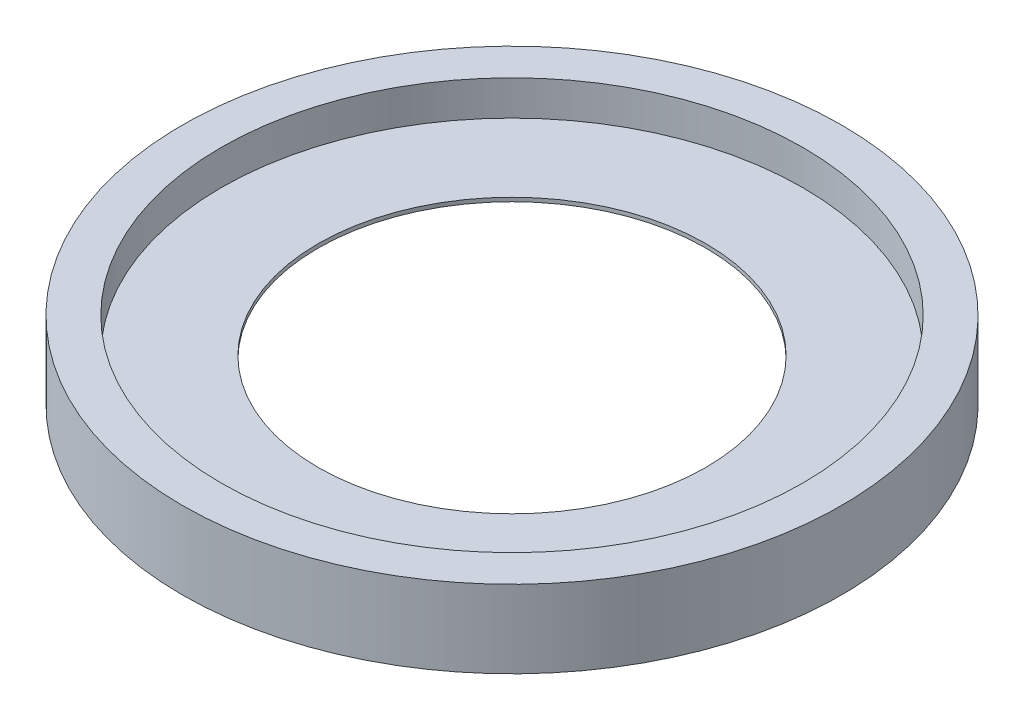
ISO-10303-21;
HEADER;
FILE_DESCRIPTION(('STEP AP214'),'2;1');
FILE_NAME('part.step','',(''),(''),'','','');
FILE_SCHEMA(('AUTOMOTIVE_DESIGN { 1 0 10303 214 1 1 1 1 }'));
ENDSEC;
DATA;
#1=APPLICATION_CONTEXT('core data for automotive mechanical design processes');
#2=APPLICATION_PROTOCOL_DEFINITION('international standard','automotive_design',2000,#1);
#3=PRODUCT_CONTEXT('',#1,'mechanical');
#4=PRODUCT('Part','Part','',(#3));
#5=PRODUCT_RELATED_PRODUCT_CATEGORY('part','',(#4));
#6=PRODUCT_DEFINITION_FORMATION('','',#4);
#7=PRODUCT_DEFINITION_CONTEXT('part definition',#1,'design');
#8=PRODUCT_DEFINITION('design','',#6,#7);
#9=PRODUCT_DEFINITION_SHAPE('','',#8);
#10=(LENGTH_UNIT() NAMED_UNIT(*) SI_UNIT(.MILLI.,.METRE.));
#11=(NAMED_UNIT(*) PLANE_ANGLE_UNIT() SI_UNIT($,.RADIAN.));
#12=(NAMED_UNIT(*) SI_UNIT($,.STERADIAN.) SOLID_ANGLE_UNIT());
#13=UNCERTAINTY_MEASURE_WITH_UNIT(LENGTH_MEASURE(1.E-05),#10,'distance_accuracy_value','');
#14=(GEOMETRIC_REPRESENTATION_CONTEXT(3) GLOBAL_UNCERTAINTY_ASSIGNED_CONTEXT((#13)) GLOBAL_UNIT_ASSIGNED_CONTEXT((#10,
#11,#12)) REPRESENTATION_CONTEXT('',''));
#15=CARTESIAN_POINT('',(0.,0.,0.));
#16=DIRECTION('',(0.,0.,1.));
#17=DIRECTION('',(1.,0.,0.));
#18=AXIS2_PLACEMENT_3D('',#15,#16,#17);
#19=CARTESIAN_POINT('',(0.,2.,0.));
#20=DIRECTION('',(0.,-1.,0.));
#21=DIRECTION('',(0.,0.,-1.));
#22=AXIS2_PLACEMENT_3D('',#19,#20,#21);
#23=CYLINDRICAL_SURFACE('',#22,7.5);
#24=CARTESIAN_POINT('',(0.,0.,0.));
#25=DIRECTION('',(0.,1.,0.));
#26=DIRECTION('',(0.,0.,1.));
#27=AXIS2_PLACEMENT_3D('',#24,#25,#26);
#28=CIRCLE('',#27,7.5);
#29=CARTESIAN_POINT('',(0.,0.,7.5));
#30=VERTEX_POINT('',#29);
#31=EDGE_CURVE('E62',#30,#30,#28,.T.);
#32=ORIENTED_EDGE('',*,*,#31,.F.);
#33=EDGE_LOOP('',(#32));
#34=FACE_BOUND('',#33,.T.);
#35=CARTESIAN_POINT('',(0.,1.,0.));
#36=DIRECTION('',(0.,1.,0.));
#37=DIRECTION('',(0.,0.,1.));
#38=AXIS2_PLACEMENT_3D('',#35,#36,#37);
#39=CIRCLE('',#38,7.5);
#40=CARTESIAN_POINT('',(0.,1.,7.5));
#41=VERTEX_POINT('',#40);
#42=EDGE_CURVE('E66',#41,#41,#39,.T.);
#43=ORIENTED_EDGE('',*,*,#42,.T.);
#44=EDGE_LOOP('',(#43));
#45=FACE_BOUND('',#44,.T.);
#46=ADVANCED_FACE('F41',(#34,#45),#23,.F.);
#47=CARTESIAN_POINT('',(0.,2.,0.));
#48=DIRECTION('',(0.,1.,0.));
#49=DIRECTION('',(0.,0.,1.));
#50=AXIS2_PLACEMENT_3D('',#47,#48,#49);
#51=PLANE('',#50);
#52=CARTESIAN_POINT('',(0.,2.,0.));
#53=DIRECTION('',(0.,1.,0.));
#54=DIRECTION('',(0.,0.,1.));
#55=AXIS2_PLACEMENT_3D('',#52,#53,#54);
#56=CIRCLE('',#55,8.5);
#57=CARTESIAN_POINT('',(0.,2.,8.5));
#58=VERTEX_POINT('',#57);
#59=EDGE_CURVE('E49',#58,#58,#56,.T.);
#60=ORIENTED_EDGE('',*,*,#59,.T.);
#61=EDGE_LOOP('',(#60));
#62=FACE_BOUND('',#61,.T.);
#63=CARTESIAN_POINT('',(0.,2.,0.));
#64=DIRECTION('',(0.,1.,0.));
#65=DIRECTION('',(0.,0.,1.));
#66=AXIS2_PLACEMENT_3D('',#63,#64,#65);
#67=CIRCLE('',#66,7.5);
#68=CARTESIAN_POINT('',(0.,2.,7.5));
#69=VERTEX_POINT('',#68);
#70=EDGE_CURVE('E60',#69,#69,#67,.T.);
#71=ORIENTED_EDGE('',*,*,#70,.F.);
#72=EDGE_LOOP('',(#71));
#73=FACE_BOUND('',#72,.T.);
#74=ADVANCED_FACE('F100',(#62,#73),#51,.T.);
#75=CARTESIAN_POINT('',(0.,0.,0.));
#76=DIRECTION('',(0.,1.,0.));
#77=DIRECTION('',(0.,0.,1.));
#78=AXIS2_PLACEMENT_3D('',#75,#76,#77);
#79=PLANE('',#78);
#80=CARTESIAN_POINT('',(0.,0.,0.));
#81=DIRECTION('',(0.,1.,0.));
#82=DIRECTION('',(0.,0.,1.));
#83=AXIS2_PLACEMENT_3D('',#80,#81,#82);
#84=CIRCLE('',#83,8.5);
#85=CARTESIAN_POINT('',(0.,0.,8.5));
#86=VERTEX_POINT('',#85);
#87=EDGE_CURVE('E54',#86,#86,#84,.T.);
#88=ORIENTED_EDGE('',*,*,#87,.F.);
#89=EDGE_LOOP('',(#88));
#90=FACE_BOUND('',#89,.T.);
#91=ORIENTED_EDGE('',*,*,#31,.T.);
#92=EDGE_LOOP('',(#91));
#93=FACE_BOUND('',#92,.T.);
#94=ADVANCED_FACE('F105',(#90,#93),#79,.F.);
#95=CARTESIAN_POINT('',(0.,2.,0.));
#96=DIRECTION('',(0.,-1.,0.));
#97=DIRECTION('',(0.,0.,-1.));
#98=AXIS2_PLACEMENT_3D('',#95,#96,#97);
#99=CYLINDRICAL_SURFACE('',#98,8.5);
#100=ORIENTED_EDGE('',*,*,#59,.F.);
#101=EDGE_LOOP('',(#100));
#102=FACE_BOUND('',#101,.T.);
#103=ORIENTED_EDGE('',*,*,#87,.T.);
#104=EDGE_LOOP('',(#103));
#105=FACE_BOUND('',#104,.T.);
#106=ADVANCED_FACE('F43',(#102,#105),#99,.T.);
#107=CARTESIAN_POINT('',(0.,1.1,0.));
#108=DIRECTION('',(0.,1.,0.));
#109=DIRECTION('',(0.,0.,1.));
#110=AXIS2_PLACEMENT_3D('',#107,#108,#109);
#111=CIRCLE('',#110,7.5);
#112=CARTESIAN_POINT('',(0.,1.1,7.5));
#113=VERTEX_POINT('',#112);
#114=EDGE_CURVE('E10',#113,#113,#111,.T.);
#115=ORIENTED_EDGE('',*,*,#114,.F.);
#116=EDGE_LOOP('',(#115));
#117=FACE_BOUND('',#116,.T.);
#118=ORIENTED_EDGE('',*,*,#70,.T.);
#119=EDGE_LOOP('',(#118));
#120=FACE_BOUND('',#119,.T.);
#121=ADVANCED_FACE('F88',(#117,#120),#23,.F.);
#122=CARTESIAN_POINT('',(0.,1.1,0.));
#123=DIRECTION('',(0.,1.,0.));
#124=DIRECTION('',(0.,0.,1.));
#125=AXIS2_PLACEMENT_3D('',#122,#123,#124);
#126=PLANE('',#125);
#127=ORIENTED_EDGE('',*,*,#114,.T.);
#128=EDGE_LOOP('',(#127));
#129=FACE_BOUND('',#128,.T.);
#130=CARTESIAN_POINT('',(0.,1.1,0.));
#131=DIRECTION('',(0.,1.,0.));
#132=DIRECTION('',(0.,0.,1.));
#133=AXIS2_PLACEMENT_3D('',#130,#131,#132);
#134=CIRCLE('',#133,5.);
#135=CARTESIAN_POINT('',(0.,1.1,5.));
#136=VERTEX_POINT('',#135);
#137=EDGE_CURVE('E73',#136,#136,#134,.T.);
#138=ORIENTED_EDGE('',*,*,#137,.F.);
#139=EDGE_LOOP('',(#138));
#140=FACE_BOUND('',#139,.T.);
#141=ADVANCED_FACE('F85',(#129,#140),#126,.T.);
#142=CARTESIAN_POINT('',(0.,1.,0.));
#143=DIRECTION('',(0.,1.,0.));
#144=DIRECTION('',(0.,0.,1.));
#145=AXIS2_PLACEMENT_3D('',#142,#143,#144);
#146=PLANE('',#145);
#147=ORIENTED_EDGE('',*,*,#42,.F.);
#148=EDGE_LOOP('',(#147));
#149=FACE_BOUND('',#148,.T.);
#150=CARTESIAN_POINT('',(0.,1.,0.));
#151=DIRECTION('',(0.,1.,0.));
#152=DIRECTION('',(0.,0.,1.));
#153=AXIS2_PLACEMENT_3D('',#150,#151,#152);
#154=CIRCLE('',#153,5.);
#155=CARTESIAN_POINT('',(0.,1.,5.));
#156=VERTEX_POINT('',#155);
#157=EDGE_CURVE('E74',#156,#156,#154,.T.);
#158=ORIENTED_EDGE('',*,*,#157,.T.);
#159=EDGE_LOOP('',(#158));
#160=FACE_BOUND('',#159,.T.);
#161=ADVANCED_FACE('F87',(#149,#160),#146,.F.);
#162=CARTESIAN_POINT('',(0.,1.1,0.));
#163=DIRECTION('',(0.,-1.,0.));
#164=DIRECTION('',(0.,0.,-1.));
#165=AXIS2_PLACEMENT_3D('',#162,#163,#164);
#166=CYLINDRICAL_SURFACE('',#165,5.);
#167=ORIENTED_EDGE('',*,*,#137,.T.);
#168=EDGE_LOOP('',(#167));
#169=FACE_BOUND('',#168,.T.);
#170=ORIENTED_EDGE('',*,*,#157,.F.);
#171=EDGE_LOOP('',(#170));
#172=FACE_BOUND('',#171,.T.);
#173=ADVANCED_FACE('F82',(#169,#172),#166,.F.);
#174=CLOSED_SHELL('',(#46,#74,#94,#106,#121,#141,#161,#173));
#175=MANIFOLD_SOLID_BREP('B2',#174);
#176=ADVANCED_BREP_SHAPE_REPRESENTATION('',(#18,#175),#14);
#177=SHAPE_DEFINITION_REPRESENTATION(#9,#176);
ENDSEC;
END-ISO-10303-21;
